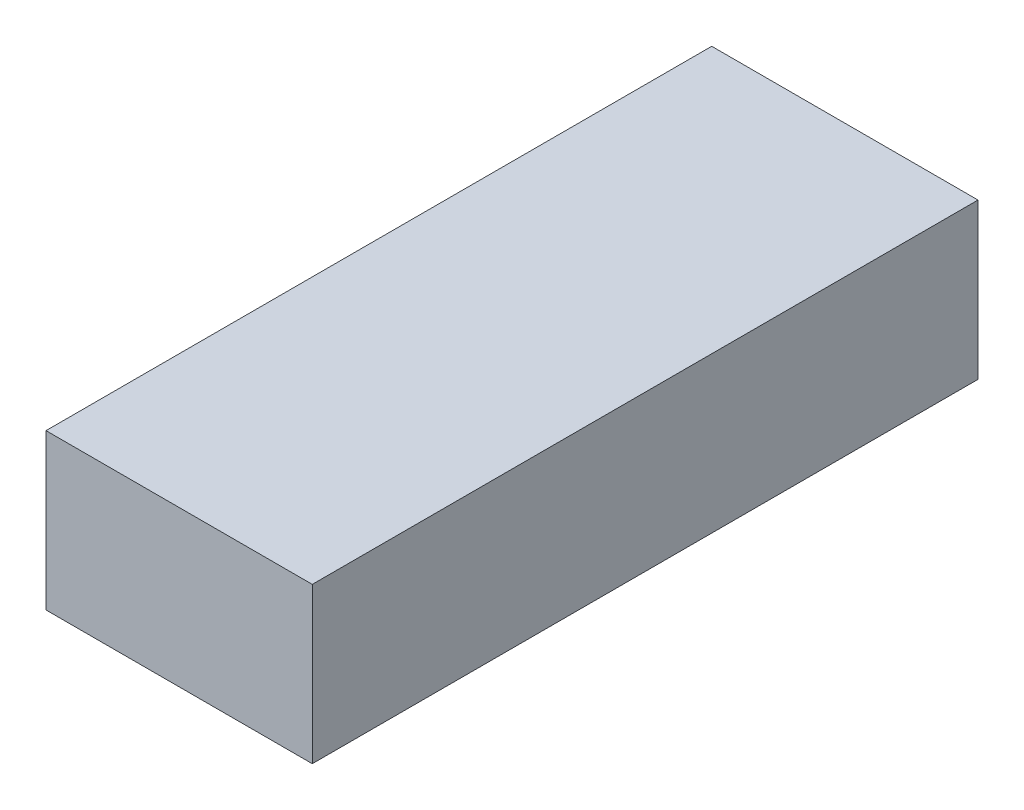
ISO-10303-21;
HEADER;
FILE_DESCRIPTION(('STEP AP214'),'2;1');
FILE_NAME('part.step','',(''),(''),'','','');
FILE_SCHEMA(('AUTOMOTIVE_DESIGN { 1 0 10303 214 1 1 1 1 }'));
ENDSEC;
DATA;
#1=APPLICATION_CONTEXT('core data for automotive mechanical design processes');
#2=APPLICATION_PROTOCOL_DEFINITION('international standard','automotive_design',2000,#1);
#3=PRODUCT_CONTEXT('',#1,'mechanical');
#4=PRODUCT('Part','Part','',(#3));
#5=PRODUCT_RELATED_PRODUCT_CATEGORY('part','',(#4));
#6=PRODUCT_DEFINITION_FORMATION('','',#4);
#7=PRODUCT_DEFINITION_CONTEXT('part definition',#1,'design');
#8=PRODUCT_DEFINITION('design','',#6,#7);
#9=PRODUCT_DEFINITION_SHAPE('','',#8);
#10=(LENGTH_UNIT() NAMED_UNIT(*) SI_UNIT(.MILLI.,.METRE.));
#11=(NAMED_UNIT(*) PLANE_ANGLE_UNIT() SI_UNIT($,.RADIAN.));
#12=(NAMED_UNIT(*) SI_UNIT($,.STERADIAN.) SOLID_ANGLE_UNIT());
#13=UNCERTAINTY_MEASURE_WITH_UNIT(LENGTH_MEASURE(1.E-05),#10,'distance_accuracy_value','');
#14=(GEOMETRIC_REPRESENTATION_CONTEXT(3) GLOBAL_UNCERTAINTY_ASSIGNED_CONTEXT((#13)) GLOBAL_UNIT_ASSIGNED_CONTEXT((#10,
#11,#12)) REPRESENTATION_CONTEXT('',''));
#15=CARTESIAN_POINT('',(0.,0.,0.));
#16=DIRECTION('',(0.,0.,1.));
#17=DIRECTION('',(1.,0.,0.));
#18=AXIS2_PLACEMENT_3D('',#15,#16,#17);
#19=CARTESIAN_POINT('',(-152.4,-88.9,762.));
#20=DIRECTION('',(1.,0.,0.));
#21=DIRECTION('',(0.,0.,-1.));
#22=AXIS2_PLACEMENT_3D('',#19,#20,#21);
#23=PLANE('',#22);
#24=DIRECTION('',(0.,-1.,0.));
#25=VECTOR('',#24,1.);
#26=CARTESIAN_POINT('',(-152.4,-88.9,0.));
#27=LINE('',#26,#25);
#28=CARTESIAN_POINT('',(-152.4,88.9,0.));
#29=VERTEX_POINT('',#28);
#30=CARTESIAN_POINT('',(-152.4,-88.9,0.));
#31=VERTEX_POINT('',#30);
#32=EDGE_CURVE('E113',#29,#31,#27,.T.);
#33=ORIENTED_EDGE('',*,*,#32,.T.);
#34=DIRECTION('',(0.,0.,-1.));
#35=VECTOR('',#34,1.);
#36=CARTESIAN_POINT('',(-152.4,-88.9,762.));
#37=LINE('',#36,#35);
#38=CARTESIAN_POINT('',(-152.4,-88.9,762.));
#39=VERTEX_POINT('',#38);
#40=EDGE_CURVE('E11',#39,#31,#37,.T.);
#41=ORIENTED_EDGE('',*,*,#40,.F.);
#42=DIRECTION('',(0.,-1.,0.));
#43=VECTOR('',#42,1.);
#44=CARTESIAN_POINT('',(-152.4,-88.9,762.));
#45=LINE('',#44,#43);
#46=CARTESIAN_POINT('',(-152.4,88.9,762.));
#47=VERTEX_POINT('',#46);
#48=EDGE_CURVE('E97',#47,#39,#45,.T.);
#49=ORIENTED_EDGE('',*,*,#48,.F.);
#50=DIRECTION('',(0.,0.,-1.));
#51=VECTOR('',#50,1.);
#52=CARTESIAN_POINT('',(-152.4,88.9,762.));
#53=LINE('',#52,#51);
#54=EDGE_CURVE('E109',#47,#29,#53,.T.);
#55=ORIENTED_EDGE('',*,*,#54,.T.);
#56=EDGE_LOOP('',(#33,#41,#49,#55));
#57=FACE_BOUND('',#56,.T.);
#58=ADVANCED_FACE('F45',(#57),#23,.F.);
#59=CARTESIAN_POINT('',(152.4,-88.8999999999999,762.));
#60=DIRECTION('',(0.,1.,0.));
#61=DIRECTION('',(-1.,0.,0.));
#62=AXIS2_PLACEMENT_3D('',#59,#60,#61);
#63=PLANE('',#62);
#64=DIRECTION('',(1.,0.,0.));
#65=VECTOR('',#64,1.);
#66=CARTESIAN_POINT('',(152.4,-88.8999999999999,0.));
#67=LINE('',#66,#65);
#68=CARTESIAN_POINT('',(152.4,-88.8999999999999,0.));
#69=VERTEX_POINT('',#68);
#70=EDGE_CURVE('E102',#31,#69,#67,.T.);
#71=ORIENTED_EDGE('',*,*,#70,.T.);
#72=DIRECTION('',(0.,0.,-1.));
#73=VECTOR('',#72,1.);
#74=CARTESIAN_POINT('',(152.4,-88.8999999999999,762.));
#75=LINE('',#74,#73);
#76=CARTESIAN_POINT('',(152.4,-88.8999999999999,762.));
#77=VERTEX_POINT('',#76);
#78=EDGE_CURVE('E54',#77,#69,#75,.T.);
#79=ORIENTED_EDGE('',*,*,#78,.F.);
#80=DIRECTION('',(1.,0.,0.));
#81=VECTOR('',#80,1.);
#82=CARTESIAN_POINT('',(152.4,-88.8999999999999,762.));
#83=LINE('',#82,#81);
#84=EDGE_CURVE('E92',#39,#77,#83,.T.);
#85=ORIENTED_EDGE('',*,*,#84,.F.);
#86=ORIENTED_EDGE('',*,*,#40,.T.);
#87=EDGE_LOOP('',(#71,#79,#85,#86));
#88=FACE_BOUND('',#87,.T.);
#89=ADVANCED_FACE('F101',(#88),#63,.F.);
#90=CARTESIAN_POINT('',(152.4,-88.8999999999999,762.));
#91=DIRECTION('',(-1.,0.,0.));
#92=DIRECTION('',(0.,-1.,0.));
#93=AXIS2_PLACEMENT_3D('',#90,#91,#92);
#94=PLANE('',#93);
#95=DIRECTION('',(0.,1.,0.));
#96=VECTOR('',#95,1.);
#97=CARTESIAN_POINT('',(152.4,-88.8999999999999,0.));
#98=LINE('',#97,#96);
#99=CARTESIAN_POINT('',(152.4,88.9,0.));
#100=VERTEX_POINT('',#99);
#101=EDGE_CURVE('E79',#69,#100,#98,.T.);
#102=ORIENTED_EDGE('',*,*,#101,.T.);
#103=DIRECTION('',(0.,0.,-1.));
#104=VECTOR('',#103,1.);
#105=CARTESIAN_POINT('',(152.4,88.9,762.));
#106=LINE('',#105,#104);
#107=CARTESIAN_POINT('',(152.4,88.9,762.));
#108=VERTEX_POINT('',#107);
#109=EDGE_CURVE('E104',#108,#100,#106,.T.);
#110=ORIENTED_EDGE('',*,*,#109,.F.);
#111=DIRECTION('',(0.,1.,0.));
#112=VECTOR('',#111,1.);
#113=CARTESIAN_POINT('',(152.4,-88.8999999999999,762.));
#114=LINE('',#113,#112);
#115=EDGE_CURVE('E95',#77,#108,#114,.T.);
#116=ORIENTED_EDGE('',*,*,#115,.F.);
#117=ORIENTED_EDGE('',*,*,#78,.T.);
#118=EDGE_LOOP('',(#102,#110,#116,#117));
#119=FACE_BOUND('',#118,.T.);
#120=ADVANCED_FACE('F105',(#119),#94,.F.);
#121=CARTESIAN_POINT('',(152.4,88.9,762.));
#122=DIRECTION('',(0.,-1.,0.));
#123=DIRECTION('',(1.,0.,0.));
#124=AXIS2_PLACEMENT_3D('',#121,#122,#123);
#125=PLANE('',#124);
#126=DIRECTION('',(-1.,0.,0.));
#127=VECTOR('',#126,1.);
#128=CARTESIAN_POINT('',(152.4,88.9,0.));
#129=LINE('',#128,#127);
#130=EDGE_CURVE('E85',#100,#29,#129,.T.);
#131=ORIENTED_EDGE('',*,*,#130,.T.);
#132=ORIENTED_EDGE('',*,*,#54,.F.);
#133=DIRECTION('',(-1.,0.,0.));
#134=VECTOR('',#133,1.);
#135=CARTESIAN_POINT('',(152.4,88.9,762.));
#136=LINE('',#135,#134);
#137=EDGE_CURVE('E62',#108,#47,#136,.T.);
#138=ORIENTED_EDGE('',*,*,#137,.F.);
#139=ORIENTED_EDGE('',*,*,#109,.T.);
#140=EDGE_LOOP('',(#131,#132,#138,#139));
#141=FACE_BOUND('',#140,.T.);
#142=ADVANCED_FACE('F126',(#141),#125,.F.);
#143=CARTESIAN_POINT('',(0.,0.,762.));
#144=DIRECTION('',(0.,0.,1.));
#145=DIRECTION('',(1.,0.,0.));
#146=AXIS2_PLACEMENT_3D('',#143,#144,#145);
#147=PLANE('',#146);
#148=ORIENTED_EDGE('',*,*,#48,.T.);
#149=ORIENTED_EDGE('',*,*,#84,.T.);
#150=ORIENTED_EDGE('',*,*,#115,.T.);
#151=ORIENTED_EDGE('',*,*,#137,.T.);
#152=EDGE_LOOP('',(#148,#149,#150,#151));
#153=FACE_BOUND('',#152,.T.);
#154=ADVANCED_FACE('F93',(#153),#147,.T.);
#155=CARTESIAN_POINT('',(0.,0.,0.));
#156=DIRECTION('',(0.,0.,1.));
#157=DIRECTION('',(1.,0.,0.));
#158=AXIS2_PLACEMENT_3D('',#155,#156,#157);
#159=PLANE('',#158);
#160=ORIENTED_EDGE('',*,*,#32,.F.);
#161=ORIENTED_EDGE('',*,*,#130,.F.);
#162=ORIENTED_EDGE('',*,*,#101,.F.);
#163=ORIENTED_EDGE('',*,*,#70,.F.);
#164=EDGE_LOOP('',(#160,#161,#162,#163));
#165=FACE_BOUND('',#164,.T.);
#166=ADVANCED_FACE('F129',(#165),#159,.F.);
#167=CLOSED_SHELL('',(#58,#89,#120,#142,#154,#166));
#168=MANIFOLD_SOLID_BREP('B2',#167);
#169=ADVANCED_BREP_SHAPE_REPRESENTATION('',(#18,#168),#14);
#170=SHAPE_DEFINITION_REPRESENTATION(#9,#169);
ENDSEC;
END-ISO-10303-21;
